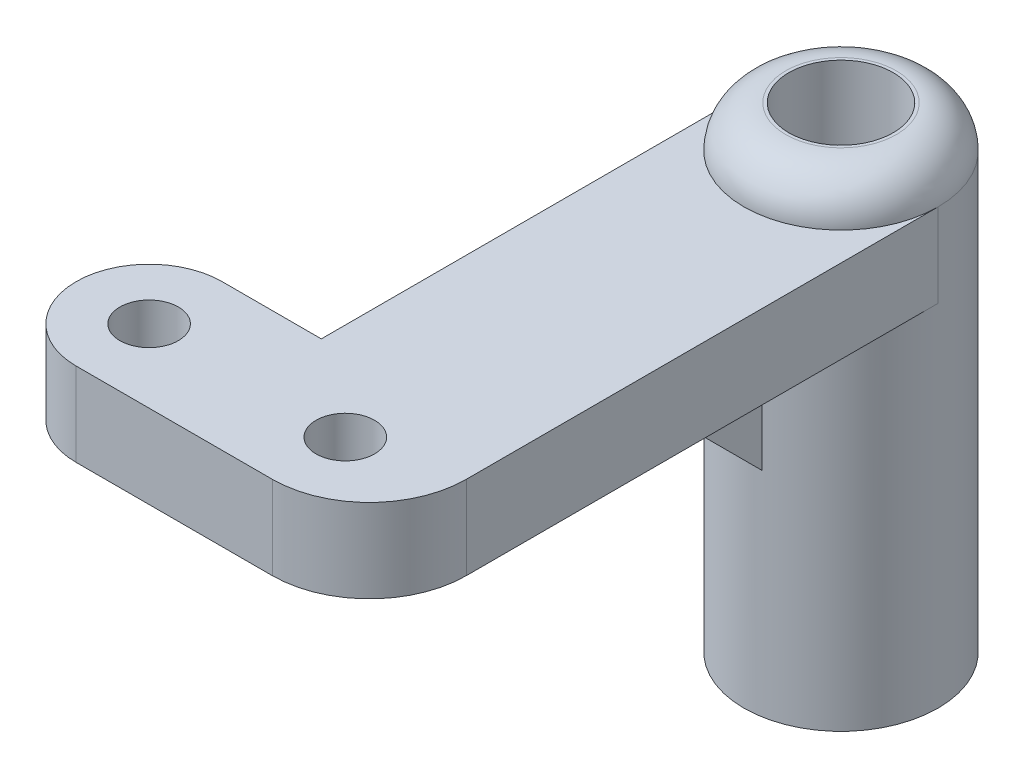
ISO-10303-21;
HEADER;
FILE_DESCRIPTION(('STEP AP214'),'2;1');
FILE_NAME('part.step','',(''),(''),'','','');
FILE_SCHEMA(('AUTOMOTIVE_DESIGN { 1 0 10303 214 1 1 1 1 }'));
ENDSEC;
DATA;
#1=APPLICATION_CONTEXT('core data for automotive mechanical design processes');
#2=APPLICATION_PROTOCOL_DEFINITION('international standard','automotive_design',2000,#1);
#3=PRODUCT_CONTEXT('',#1,'mechanical');
#4=PRODUCT('Part','Part','',(#3));
#5=PRODUCT_RELATED_PRODUCT_CATEGORY('part','',(#4));
#6=PRODUCT_DEFINITION_FORMATION('','',#4);
#7=PRODUCT_DEFINITION_CONTEXT('part definition',#1,'design');
#8=PRODUCT_DEFINITION('design','',#6,#7);
#9=PRODUCT_DEFINITION_SHAPE('','',#8);
#10=(LENGTH_UNIT() NAMED_UNIT(*) SI_UNIT(.MILLI.,.METRE.));
#11=(NAMED_UNIT(*) PLANE_ANGLE_UNIT() SI_UNIT($,.RADIAN.));
#12=(NAMED_UNIT(*) SI_UNIT($,.STERADIAN.) SOLID_ANGLE_UNIT());
#13=UNCERTAINTY_MEASURE_WITH_UNIT(LENGTH_MEASURE(1.E-05),#10,'distance_accuracy_value','');
#14=(GEOMETRIC_REPRESENTATION_CONTEXT(3) GLOBAL_UNCERTAINTY_ASSIGNED_CONTEXT((#13)) GLOBAL_UNIT_ASSIGNED_CONTEXT((#10,
#11,#12)) REPRESENTATION_CONTEXT('',''));
#15=CARTESIAN_POINT('',(0.,0.,0.));
#16=DIRECTION('',(0.,0.,1.));
#17=DIRECTION('',(1.,0.,0.));
#18=AXIS2_PLACEMENT_3D('',#15,#16,#17);
#19=CARTESIAN_POINT('',(0.,0.,0.));
#20=DIRECTION('',(0.,1.,0.));
#21=DIRECTION('',(0.,0.,1.));
#22=AXIS2_PLACEMENT_3D('',#19,#20,#21);
#23=PLANE('',#22);
#24=CARTESIAN_POINT('',(0.,0.,1.15));
#25=DIRECTION('',(0.,1.,0.));
#26=DIRECTION('',(0.,0.,1.));
#27=AXIS2_PLACEMENT_3D('',#24,#25,#26);
#28=CIRCLE('',#27,1.4);
#29=CARTESIAN_POINT('',(0.,0.,2.55));
#30=VERTEX_POINT('',#29);
#31=EDGE_CURVE('E164',#30,#30,#28,.T.);
#32=ORIENTED_EDGE('',*,*,#31,.T.);
#33=EDGE_LOOP('',(#32));
#34=FACE_BOUND('',#33,.T.);
#35=CARTESIAN_POINT('',(-9.4,0.,1.15));
#36=DIRECTION('',(0.,1.,0.));
#37=DIRECTION('',(0.,0.,1.));
#38=AXIS2_PLACEMENT_3D('',#35,#36,#37);
#39=CIRCLE('',#38,1.4);
#40=CARTESIAN_POINT('',(-9.4,0.,2.55));
#41=VERTEX_POINT('',#40);
#42=EDGE_CURVE('E198',#41,#41,#39,.T.);
#43=ORIENTED_EDGE('',*,*,#42,.T.);
#44=EDGE_LOOP('',(#43));
#45=FACE_BOUND('',#44,.T.);
#46=DIRECTION('',(0.,0.,-1.));
#47=VECTOR('',#46,1.);
#48=CARTESIAN_POINT('',(0.8,0.,0.));
#49=LINE('',#48,#47);
#50=CARTESIAN_POINT('',(0.8,0.,-11.45));
#51=VERTEX_POINT('',#50);
#52=CARTESIAN_POINT('',(0.8,0.,-18.0193341095426));
#53=VERTEX_POINT('',#52);
#54=EDGE_CURVE('E127',#51,#53,#49,.T.);
#55=ORIENTED_EDGE('',*,*,#54,.T.);
#56=CARTESIAN_POINT('',(0.,0.,-22.6));
#57=DIRECTION('',(0.,-1.,0.));
#58=DIRECTION('',(0.,0.,-1.));
#59=AXIS2_PLACEMENT_3D('',#56,#57,#58);
#60=CIRCLE('',#59,4.65);
#61=CARTESIAN_POINT('',(4.65,0.,-22.6));
#62=VERTEX_POINT('',#61);
#63=EDGE_CURVE('E151',#62,#53,#60,.T.);
#64=ORIENTED_EDGE('',*,*,#63,.F.);
#65=DIRECTION('',(0.,0.,-1.));
#66=VECTOR('',#65,1.);
#67=CARTESIAN_POINT('',(4.65,0.,0.));
#68=LINE('',#67,#66);
#69=CARTESIAN_POINT('',(4.65,0.,0.));
#70=VERTEX_POINT('',#69);
#71=EDGE_CURVE('E187',#70,#62,#68,.T.);
#72=ORIENTED_EDGE('',*,*,#71,.F.);
#73=CARTESIAN_POINT('',(0.,0.,0.));
#74=DIRECTION('',(0.,1.,0.));
#75=DIRECTION('',(0.,0.,1.));
#76=AXIS2_PLACEMENT_3D('',#73,#74,#75);
#77=CIRCLE('',#76,4.65);
#78=CARTESIAN_POINT('',(0.,0.,4.65));
#79=VERTEX_POINT('',#78);
#80=EDGE_CURVE('E185',#79,#70,#77,.T.);
#81=ORIENTED_EDGE('',*,*,#80,.F.);
#82=DIRECTION('',(-1.,0.,0.));
#83=VECTOR('',#82,1.);
#84=CARTESIAN_POINT('',(0.,0.,4.65));
#85=LINE('',#84,#83);
#86=CARTESIAN_POINT('',(-9.4,0.,4.65));
#87=VERTEX_POINT('',#86);
#88=EDGE_CURVE('E159',#79,#87,#85,.T.);
#89=ORIENTED_EDGE('',*,*,#88,.T.);
#90=CARTESIAN_POINT('',(-9.4,0.,1.15));
#91=DIRECTION('',(0.,1.,0.));
#92=DIRECTION('',(0.,0.,1.));
#93=AXIS2_PLACEMENT_3D('',#90,#91,#92);
#94=CIRCLE('',#93,3.5);
#95=CARTESIAN_POINT('',(-9.4,0.,-2.35));
#96=VERTEX_POINT('',#95);
#97=EDGE_CURVE('E195',#96,#87,#94,.T.);
#98=ORIENTED_EDGE('',*,*,#97,.F.);
#99=DIRECTION('',(-1.,0.,0.));
#100=VECTOR('',#99,1.);
#101=CARTESIAN_POINT('',(0.,0.,-2.35));
#102=LINE('',#101,#100);
#103=CARTESIAN_POINT('',(-4.65,0.,-2.35));
#104=VERTEX_POINT('',#103);
#105=EDGE_CURVE('E193',#104,#96,#102,.T.);
#106=ORIENTED_EDGE('',*,*,#105,.F.);
#107=DIRECTION('',(0.,0.,-1.));
#108=VECTOR('',#107,1.);
#109=CARTESIAN_POINT('',(-4.65,0.,0.));
#110=LINE('',#109,#108);
#111=CARTESIAN_POINT('',(-4.65,0.,-22.6));
#112=VERTEX_POINT('',#111);
#113=EDGE_CURVE('E190',#104,#112,#110,.T.);
#114=ORIENTED_EDGE('',*,*,#113,.T.);
#115=CARTESIAN_POINT('',(-0.8,0.,-18.0193341095426));
#116=VERTEX_POINT('',#115);
#117=EDGE_CURVE('E154',#116,#112,#60,.T.);
#118=ORIENTED_EDGE('',*,*,#117,.F.);
#119=DIRECTION('',(0.,0.,-1.));
#120=VECTOR('',#119,1.);
#121=CARTESIAN_POINT('',(-0.8,0.,0.));
#122=LINE('',#121,#120);
#123=CARTESIAN_POINT('',(-0.8,0.,-11.45));
#124=VERTEX_POINT('',#123);
#125=EDGE_CURVE('E61',#124,#116,#122,.T.);
#126=ORIENTED_EDGE('',*,*,#125,.F.);
#127=DIRECTION('',(1.,0.,0.));
#128=VECTOR('',#127,1.);
#129=CARTESIAN_POINT('',(0.,0.,-11.45));
#130=LINE('',#129,#128);
#131=EDGE_CURVE('E56',#124,#51,#130,.T.);
#132=ORIENTED_EDGE('',*,*,#131,.T.);
#133=EDGE_LOOP('',(#55,#64,#72,#81,#89,#98,#106,#114,#118,#126,#132));
#134=FACE_BOUND('',#133,.T.);
#135=ADVANCED_FACE('F41',(#34,#45,#134),#23,.F.);
#136=CARTESIAN_POINT('',(0.,4.,4.65));
#137=DIRECTION('',(0.,0.,1.));
#138=DIRECTION('',(1.,0.,0.));
#139=AXIS2_PLACEMENT_3D('',#136,#137,#138);
#140=PLANE('',#139);
#141=ORIENTED_EDGE('',*,*,#88,.F.);
#142=DIRECTION('',(0.,-1.,0.));
#143=VECTOR('',#142,1.);
#144=CARTESIAN_POINT('',(0.,4.,4.65));
#145=LINE('',#144,#143);
#146=CARTESIAN_POINT('',(0.,4.,4.65));
#147=VERTEX_POINT('',#146);
#148=EDGE_CURVE('E147',#147,#79,#145,.T.);
#149=ORIENTED_EDGE('',*,*,#148,.F.);
#150=DIRECTION('',(-1.,0.,0.));
#151=VECTOR('',#150,1.);
#152=CARTESIAN_POINT('',(0.,4.,4.65));
#153=LINE('',#152,#151);
#154=CARTESIAN_POINT('',(-9.4,4.,4.65));
#155=VERTEX_POINT('',#154);
#156=EDGE_CURVE('E160',#147,#155,#153,.T.);
#157=ORIENTED_EDGE('',*,*,#156,.T.);
#158=DIRECTION('',(0.,-1.,0.));
#159=VECTOR('',#158,1.);
#160=CARTESIAN_POINT('',(-9.4,4.,4.65));
#161=LINE('',#160,#159);
#162=EDGE_CURVE('E182',#155,#87,#161,.T.);
#163=ORIENTED_EDGE('',*,*,#162,.T.);
#164=EDGE_LOOP('',(#141,#149,#157,#163));
#165=FACE_BOUND('',#164,.T.);
#166=ADVANCED_FACE('F235',(#165),#140,.T.);
#167=CARTESIAN_POINT('',(0.,4.,0.));
#168=DIRECTION('',(0.,-1.,0.));
#169=DIRECTION('',(0.,0.,-1.));
#170=AXIS2_PLACEMENT_3D('',#167,#168,#169);
#171=CYLINDRICAL_SURFACE('',#170,4.65);
#172=ORIENTED_EDGE('',*,*,#80,.T.);
#173=DIRECTION('',(0.,-1.,0.));
#174=VECTOR('',#173,1.);
#175=CARTESIAN_POINT('',(4.65,4.,0.));
#176=LINE('',#175,#174);
#177=CARTESIAN_POINT('',(4.65,4.,0.));
#178=VERTEX_POINT('',#177);
#179=EDGE_CURVE('E215',#178,#70,#176,.T.);
#180=ORIENTED_EDGE('',*,*,#179,.F.);
#181=CARTESIAN_POINT('',(0.,4.,0.));
#182=DIRECTION('',(0.,1.,0.));
#183=DIRECTION('',(0.,0.,1.));
#184=AXIS2_PLACEMENT_3D('',#181,#182,#183);
#185=CIRCLE('',#184,4.65);
#186=EDGE_CURVE('E163',#147,#178,#185,.T.);
#187=ORIENTED_EDGE('',*,*,#186,.F.);
#188=ORIENTED_EDGE('',*,*,#148,.T.);
#189=EDGE_LOOP('',(#172,#180,#187,#188));
#190=FACE_BOUND('',#189,.T.);
#191=ADVANCED_FACE('F241',(#190),#171,.T.);
#192=CARTESIAN_POINT('',(4.65,4.,0.));
#193=DIRECTION('',(-1.,0.,0.));
#194=DIRECTION('',(0.,0.,1.));
#195=AXIS2_PLACEMENT_3D('',#192,#193,#194);
#196=PLANE('',#195);
#197=ORIENTED_EDGE('',*,*,#71,.T.);
#198=DIRECTION('',(0.,-1.,0.));
#199=VECTOR('',#198,1.);
#200=CARTESIAN_POINT('',(4.65,4.,-22.6));
#201=LINE('',#200,#199);
#202=CARTESIAN_POINT('',(4.65,4.,-22.6));
#203=VERTEX_POINT('',#202);
#204=EDGE_CURVE('E212',#203,#62,#201,.T.);
#205=ORIENTED_EDGE('',*,*,#204,.F.);
#206=DIRECTION('',(0.,0.,-1.));
#207=VECTOR('',#206,1.);
#208=CARTESIAN_POINT('',(4.65,4.,0.));
#209=LINE('',#208,#207);
#210=EDGE_CURVE('E166',#178,#203,#209,.T.);
#211=ORIENTED_EDGE('',*,*,#210,.F.);
#212=ORIENTED_EDGE('',*,*,#179,.T.);
#213=EDGE_LOOP('',(#197,#205,#211,#212));
#214=FACE_BOUND('',#213,.T.);
#215=ADVANCED_FACE('F274',(#214),#196,.F.);
#216=CARTESIAN_POINT('',(0.,4.,-22.6));
#217=DIRECTION('',(0.,-1.,0.));
#218=DIRECTION('',(0.,0.,-1.));
#219=AXIS2_PLACEMENT_3D('',#216,#217,#218);
#220=CYLINDRICAL_SURFACE('',#219,4.65);
#221=CARTESIAN_POINT('',(0.,4.,-22.6));
#222=DIRECTION('',(0.,1.,0.));
#223=DIRECTION('',(0.,0.,1.));
#224=AXIS2_PLACEMENT_3D('',#221,#222,#223);
#225=CIRCLE('',#224,4.65);
#226=CARTESIAN_POINT('',(-4.65,4.,-22.6));
#227=VERTEX_POINT('',#226);
#228=EDGE_CURVE('E12',#227,#203,#225,.F.);
#229=ORIENTED_EDGE('',*,*,#228,.T.);
#230=ORIENTED_EDGE('',*,*,#204,.T.);
#231=ORIENTED_EDGE('',*,*,#63,.T.);
#232=DIRECTION('',(0.,-1.,0.));
#233=VECTOR('',#232,1.);
#234=CARTESIAN_POINT('',(0.8,4.,-18.0193341095426));
#235=LINE('',#234,#233);
#236=CARTESIAN_POINT('',(0.8,-6.56933410954262,-18.0193341095426));
#237=VERTEX_POINT('',#236);
#238=EDGE_CURVE('E122',#53,#237,#235,.T.);
#239=ORIENTED_EDGE('',*,*,#238,.T.);
#240=CARTESIAN_POINT('',(0.,-11.15,-22.6));
#241=DIRECTION('',(0.,-0.707106781186546,0.707106781186549));
#242=DIRECTION('',(0.,-0.707106781186549,-0.707106781186546));
#243=AXIS2_PLACEMENT_3D('',#240,#241,#242);
#244=ELLIPSE('',#243,6.5760930650349,4.65);
#245=CARTESIAN_POINT('',(-0.8,-6.56933410954261,-18.0193341095426));
#246=VERTEX_POINT('',#245);
#247=EDGE_CURVE('E115',#237,#246,#244,.T.);
#248=ORIENTED_EDGE('',*,*,#247,.T.);
#249=DIRECTION('',(0.,-1.,0.));
#250=VECTOR('',#249,1.);
#251=CARTESIAN_POINT('',(-0.8,4.,-18.0193341095426));
#252=LINE('',#251,#250);
#253=EDGE_CURVE('E119',#116,#246,#252,.T.);
#254=ORIENTED_EDGE('',*,*,#253,.F.);
#255=ORIENTED_EDGE('',*,*,#117,.T.);
#256=DIRECTION('',(0.,-1.,0.));
#257=VECTOR('',#256,1.);
#258=CARTESIAN_POINT('',(-4.65,4.,-22.6));
#259=LINE('',#258,#257);
#260=EDGE_CURVE('E209',#227,#112,#259,.T.);
#261=ORIENTED_EDGE('',*,*,#260,.F.);
#262=EDGE_LOOP('',(#229,#230,#231,#239,#248,#254,#255,#261));
#263=FACE_BOUND('',#262,.T.);
#264=CARTESIAN_POINT('',(0.,-16.8,-22.6));
#265=DIRECTION('',(0.,1.,0.));
#266=DIRECTION('',(0.,0.,1.));
#267=AXIS2_PLACEMENT_3D('',#264,#265,#266);
#268=CIRCLE('',#267,4.65);
#269=CARTESIAN_POINT('',(0.,-16.8,-17.95));
#270=VERTEX_POINT('',#269);
#271=EDGE_CURVE('E150',#270,#270,#268,.T.);
#272=ORIENTED_EDGE('',*,*,#271,.T.);
#273=EDGE_LOOP('',(#272));
#274=FACE_BOUND('',#273,.T.);
#275=ADVANCED_FACE('F117',(#263,#274),#220,.T.);
#276=CARTESIAN_POINT('',(-4.65,4.,0.));
#277=DIRECTION('',(-1.,0.,0.));
#278=DIRECTION('',(0.,0.,1.));
#279=AXIS2_PLACEMENT_3D('',#276,#277,#278);
#280=PLANE('',#279);
#281=ORIENTED_EDGE('',*,*,#113,.F.);
#282=DIRECTION('',(0.,-1.,0.));
#283=VECTOR('',#282,1.);
#284=CARTESIAN_POINT('',(-4.65,4.,-2.35));
#285=LINE('',#284,#283);
#286=CARTESIAN_POINT('',(-4.65,4.,-2.35));
#287=VERTEX_POINT('',#286);
#288=EDGE_CURVE('E207',#287,#104,#285,.T.);
#289=ORIENTED_EDGE('',*,*,#288,.F.);
#290=DIRECTION('',(0.,0.,-1.));
#291=VECTOR('',#290,1.);
#292=CARTESIAN_POINT('',(-4.65,4.,0.));
#293=LINE('',#292,#291);
#294=EDGE_CURVE('E169',#287,#227,#293,.T.);
#295=ORIENTED_EDGE('',*,*,#294,.T.);
#296=ORIENTED_EDGE('',*,*,#260,.T.);
#297=EDGE_LOOP('',(#281,#289,#295,#296));
#298=FACE_BOUND('',#297,.T.);
#299=ADVANCED_FACE('F267',(#298),#280,.T.);
#300=CARTESIAN_POINT('',(0.,4.,-2.35));
#301=DIRECTION('',(0.,0.,1.));
#302=DIRECTION('',(1.,0.,0.));
#303=AXIS2_PLACEMENT_3D('',#300,#301,#302);
#304=PLANE('',#303);
#305=ORIENTED_EDGE('',*,*,#105,.T.);
#306=DIRECTION('',(0.,-1.,0.));
#307=VECTOR('',#306,1.);
#308=CARTESIAN_POINT('',(-9.4,4.,-2.35));
#309=LINE('',#308,#307);
#310=CARTESIAN_POINT('',(-9.4,4.,-2.35));
#311=VERTEX_POINT('',#310);
#312=EDGE_CURVE('E204',#311,#96,#309,.T.);
#313=ORIENTED_EDGE('',*,*,#312,.F.);
#314=DIRECTION('',(-1.,0.,0.));
#315=VECTOR('',#314,1.);
#316=CARTESIAN_POINT('',(0.,4.,-2.35));
#317=LINE('',#316,#315);
#318=EDGE_CURVE('E172',#287,#311,#317,.T.);
#319=ORIENTED_EDGE('',*,*,#318,.F.);
#320=ORIENTED_EDGE('',*,*,#288,.T.);
#321=EDGE_LOOP('',(#305,#313,#319,#320));
#322=FACE_BOUND('',#321,.T.);
#323=ADVANCED_FACE('F257',(#322),#304,.F.);
#324=CARTESIAN_POINT('',(0.,4.,1.15));
#325=DIRECTION('',(0.,-1.,0.));
#326=DIRECTION('',(0.,0.,-1.));
#327=AXIS2_PLACEMENT_3D('',#324,#325,#326);
#328=CYLINDRICAL_SURFACE('',#327,1.4);
#329=CARTESIAN_POINT('',(0.,4.,1.15));
#330=DIRECTION('',(0.,1.,0.));
#331=DIRECTION('',(0.,0.,1.));
#332=AXIS2_PLACEMENT_3D('',#329,#330,#331);
#333=CIRCLE('',#332,1.4);
#334=CARTESIAN_POINT('',(0.,4.,2.55));
#335=VERTEX_POINT('',#334);
#336=EDGE_CURVE('E179',#335,#335,#333,.T.);
#337=ORIENTED_EDGE('',*,*,#336,.T.);
#338=EDGE_LOOP('',(#337));
#339=FACE_BOUND('',#338,.T.);
#340=ORIENTED_EDGE('',*,*,#31,.F.);
#341=EDGE_LOOP('',(#340));
#342=FACE_BOUND('',#341,.T.);
#343=ADVANCED_FACE('F253',(#339,#342),#328,.F.);
#344=CARTESIAN_POINT('',(-9.4,4.,1.15));
#345=DIRECTION('',(0.,-1.,0.));
#346=DIRECTION('',(0.,0.,-1.));
#347=AXIS2_PLACEMENT_3D('',#344,#345,#346);
#348=CYLINDRICAL_SURFACE('',#347,1.4);
#349=CARTESIAN_POINT('',(-9.4,4.,1.15));
#350=DIRECTION('',(0.,1.,0.));
#351=DIRECTION('',(0.,0.,1.));
#352=AXIS2_PLACEMENT_3D('',#349,#350,#351);
#353=CIRCLE('',#352,1.4);
#354=CARTESIAN_POINT('',(-9.4,4.,2.55));
#355=VERTEX_POINT('',#354);
#356=EDGE_CURVE('E176',#355,#355,#353,.T.);
#357=ORIENTED_EDGE('',*,*,#356,.T.);
#358=EDGE_LOOP('',(#357));
#359=FACE_BOUND('',#358,.T.);
#360=ORIENTED_EDGE('',*,*,#42,.F.);
#361=EDGE_LOOP('',(#360));
#362=FACE_BOUND('',#361,.T.);
#363=ADVANCED_FACE('F256',(#359,#362),#348,.F.);
#364=CARTESIAN_POINT('',(-9.4,4.,1.15));
#365=DIRECTION('',(0.,-1.,0.));
#366=DIRECTION('',(0.,0.,-1.));
#367=AXIS2_PLACEMENT_3D('',#364,#365,#366);
#368=CYLINDRICAL_SURFACE('',#367,3.5);
#369=ORIENTED_EDGE('',*,*,#97,.T.);
#370=ORIENTED_EDGE('',*,*,#162,.F.);
#371=CARTESIAN_POINT('',(-9.4,4.,1.15));
#372=DIRECTION('',(0.,1.,0.));
#373=DIRECTION('',(0.,0.,1.));
#374=AXIS2_PLACEMENT_3D('',#371,#372,#373);
#375=CIRCLE('',#374,3.5);
#376=EDGE_CURVE('E174',#311,#155,#375,.T.);
#377=ORIENTED_EDGE('',*,*,#376,.F.);
#378=ORIENTED_EDGE('',*,*,#312,.T.);
#379=EDGE_LOOP('',(#369,#370,#377,#378));
#380=FACE_BOUND('',#379,.T.);
#381=ADVANCED_FACE('F251',(#380),#368,.T.);
#382=CARTESIAN_POINT('',(0.,4.,-22.6));
#383=DIRECTION('',(0.,-1.,0.));
#384=DIRECTION('',(0.,0.,-1.));
#385=AXIS2_PLACEMENT_3D('',#382,#383,#384);
#386=CYLINDRICAL_SURFACE('',#385,2.5);
#387=CARTESIAN_POINT('',(0.,6.00000000000001,-22.6));
#388=DIRECTION('',(0.,1.,0.));
#389=DIRECTION('',(0.,0.,1.));
#390=AXIS2_PLACEMENT_3D('',#387,#388,#389);
#391=CIRCLE('',#390,2.5);
#392=CARTESIAN_POINT('',(0.,6.00000000000001,-20.1));
#393=VERTEX_POINT('',#392);
#394=EDGE_CURVE('E143',#393,#393,#391,.T.);
#395=ORIENTED_EDGE('',*,*,#394,.T.);
#396=EDGE_LOOP('',(#395));
#397=FACE_BOUND('',#396,.T.);
#398=CARTESIAN_POINT('',(0.,-16.8,-22.6));
#399=DIRECTION('',(0.,1.,0.));
#400=DIRECTION('',(0.,0.,1.));
#401=AXIS2_PLACEMENT_3D('',#398,#399,#400);
#402=CIRCLE('',#401,2.5);
#403=CARTESIAN_POINT('',(0.,-16.8,-20.1));
#404=VERTEX_POINT('',#403);
#405=EDGE_CURVE('E153',#404,#404,#402,.T.);
#406=ORIENTED_EDGE('',*,*,#405,.F.);
#407=EDGE_LOOP('',(#406));
#408=FACE_BOUND('',#407,.T.);
#409=ADVANCED_FACE('F248',(#397,#408),#386,.F.);
#410=CARTESIAN_POINT('',(0.,4.,0.));
#411=DIRECTION('',(0.,1.,0.));
#412=DIRECTION('',(0.,0.,1.));
#413=AXIS2_PLACEMENT_3D('',#410,#411,#412);
#414=PLANE('',#413);
#415=ORIENTED_EDGE('',*,*,#210,.T.);
#416=CARTESIAN_POINT('',(0.,4.,-22.6));
#417=DIRECTION('',(0.,1.,0.));
#418=DIRECTION('',(0.,0.,1.));
#419=AXIS2_PLACEMENT_3D('',#416,#417,#418);
#420=CIRCLE('',#419,4.65);
#421=EDGE_CURVE('E144',#227,#203,#420,.T.);
#422=ORIENTED_EDGE('',*,*,#421,.F.);
#423=ORIENTED_EDGE('',*,*,#294,.F.);
#424=ORIENTED_EDGE('',*,*,#318,.T.);
#425=ORIENTED_EDGE('',*,*,#376,.T.);
#426=ORIENTED_EDGE('',*,*,#156,.F.);
#427=ORIENTED_EDGE('',*,*,#186,.T.);
#428=EDGE_LOOP('',(#415,#422,#423,#424,#425,#426,#427));
#429=FACE_BOUND('',#428,.T.);
#430=ORIENTED_EDGE('',*,*,#356,.F.);
#431=EDGE_LOOP('',(#430));
#432=FACE_BOUND('',#431,.T.);
#433=ORIENTED_EDGE('',*,*,#336,.F.);
#434=EDGE_LOOP('',(#433));
#435=FACE_BOUND('',#434,.T.);
#436=ADVANCED_FACE('F246',(#429,#432,#435),#414,.T.);
#437=CARTESIAN_POINT('',(0.,-16.8,0.));
#438=DIRECTION('',(0.,1.,0.));
#439=DIRECTION('',(0.,0.,1.));
#440=AXIS2_PLACEMENT_3D('',#437,#438,#439);
#441=PLANE('',#440);
#442=ORIENTED_EDGE('',*,*,#405,.T.);
#443=EDGE_LOOP('',(#442));
#444=FACE_BOUND('',#443,.T.);
#445=ORIENTED_EDGE('',*,*,#271,.F.);
#446=EDGE_LOOP('',(#445));
#447=FACE_BOUND('',#446,.T.);
#448=ADVANCED_FACE('F231',(#444,#447),#441,.F.);
#449=CARTESIAN_POINT('',(0.,6.,0.));
#450=DIRECTION('',(0.,1.,0.));
#451=DIRECTION('',(0.,0.,1.));
#452=AXIS2_PLACEMENT_3D('',#449,#450,#451);
#453=PLANE('',#452);
#454=ORIENTED_EDGE('',*,*,#394,.F.);
#455=EDGE_LOOP('',(#454));
#456=FACE_BOUND('',#455,.T.);
#457=CARTESIAN_POINT('',(0.,6.,-22.6));
#458=DIRECTION('',(0.,1.,0.));
#459=DIRECTION('',(0.,0.,1.));
#460=AXIS2_PLACEMENT_3D('',#457,#458,#459);
#461=CIRCLE('',#460,2.65);
#462=CARTESIAN_POINT('',(0.,6.,-19.95));
#463=VERTEX_POINT('',#462);
#464=EDGE_CURVE('E49',#463,#463,#461,.T.);
#465=ORIENTED_EDGE('',*,*,#464,.T.);
#466=EDGE_LOOP('',(#465));
#467=FACE_BOUND('',#466,.T.);
#468=ADVANCED_FACE('F221',(#456,#467),#453,.T.);
#469=CARTESIAN_POINT('',(0.,4.,-22.6));
#470=DIRECTION('',(0.,1.,0.));
#471=DIRECTION('',(0.,0.,1.));
#472=AXIS2_PLACEMENT_3D('',#469,#470,#471);
#473=TOROIDAL_SURFACE('',#472,2.65,2.);
#474=ORIENTED_EDGE('',*,*,#421,.T.);
#475=ORIENTED_EDGE('',*,*,#228,.F.);
#476=EDGE_LOOP('',(#474,#475));
#477=FACE_BOUND('',#476,.T.);
#478=ORIENTED_EDGE('',*,*,#464,.F.);
#479=EDGE_LOOP('',(#478));
#480=FACE_BOUND('',#479,.T.);
#481=ADVANCED_FACE('F43',(#477,#480),#473,.T.);
#482=CARTESIAN_POINT('',(0.,0.,-11.45));
#483=DIRECTION('',(0.,-0.707106781186546,0.707106781186549));
#484=DIRECTION('',(0.,-0.707106781186549,-0.707106781186546));
#485=AXIS2_PLACEMENT_3D('',#482,#483,#484);
#486=PLANE('',#485);
#487=ORIENTED_EDGE('',*,*,#131,.F.);
#488=DIRECTION('',(0.,-0.707106781186549,-0.707106781186546));
#489=VECTOR('',#488,1.);
#490=CARTESIAN_POINT('',(-0.8,0.,-11.45));
#491=LINE('',#490,#489);
#492=EDGE_CURVE('E132',#124,#246,#491,.T.);
#493=ORIENTED_EDGE('',*,*,#492,.T.);
#494=ORIENTED_EDGE('',*,*,#247,.F.);
#495=DIRECTION('',(0.,-0.707106781186549,-0.707106781186546));
#496=VECTOR('',#495,1.);
#497=CARTESIAN_POINT('',(0.8,0.,-11.45));
#498=LINE('',#497,#496);
#499=EDGE_CURVE('E133',#51,#237,#498,.T.);
#500=ORIENTED_EDGE('',*,*,#499,.F.);
#501=EDGE_LOOP('',(#487,#493,#494,#500));
#502=FACE_BOUND('',#501,.T.);
#503=ADVANCED_FACE('F135',(#502),#486,.T.);
#504=CARTESIAN_POINT('',(0.8,-5.4,-11.3));
#505=DIRECTION('',(1.,0.,0.));
#506=DIRECTION('',(0.,0.,-1.));
#507=AXIS2_PLACEMENT_3D('',#504,#505,#506);
#508=PLANE('',#507);
#509=ORIENTED_EDGE('',*,*,#238,.F.);
#510=ORIENTED_EDGE('',*,*,#54,.F.);
#511=ORIENTED_EDGE('',*,*,#499,.T.);
#512=EDGE_LOOP('',(#509,#510,#511));
#513=FACE_BOUND('',#512,.T.);
#514=ADVANCED_FACE('F229',(#513),#508,.T.);
#515=CARTESIAN_POINT('',(-0.8,-5.4,-11.3));
#516=DIRECTION('',(1.,0.,0.));
#517=DIRECTION('',(0.,0.,-1.));
#518=AXIS2_PLACEMENT_3D('',#515,#516,#517);
#519=PLANE('',#518);
#520=ORIENTED_EDGE('',*,*,#492,.F.);
#521=ORIENTED_EDGE('',*,*,#125,.T.);
#522=ORIENTED_EDGE('',*,*,#253,.T.);
#523=EDGE_LOOP('',(#520,#521,#522));
#524=FACE_BOUND('',#523,.T.);
#525=ADVANCED_FACE('F131',(#524),#519,.F.);
#526=CLOSED_SHELL('',(#135,#166,#191,#215,#275,#299,#323,#343,#363,#381,#409,#436,#448,#468,
#481,#503,#514,#525));
#527=MANIFOLD_SOLID_BREP('B2',#526);
#528=ADVANCED_BREP_SHAPE_REPRESENTATION('',(#18,#527),#14);
#529=SHAPE_DEFINITION_REPRESENTATION(#9,#528);
ENDSEC;
END-ISO-10303-21;
